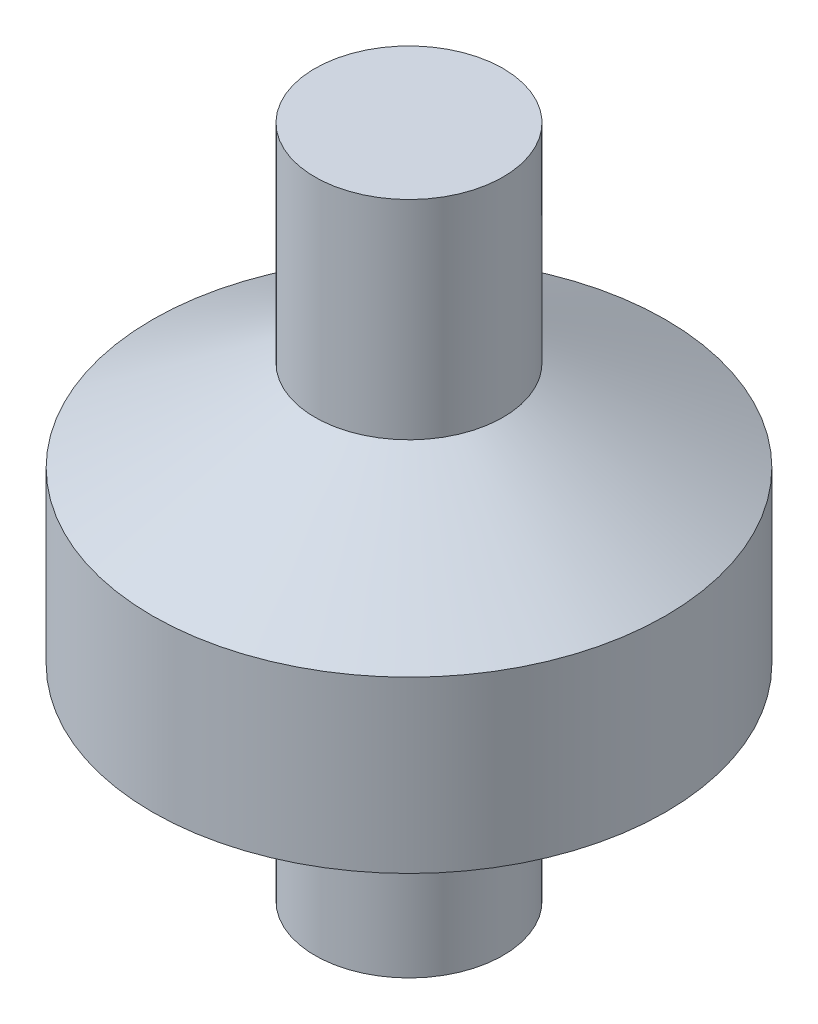
ISO-10303-21;
HEADER;
FILE_DESCRIPTION(('STEP AP214'),'2;1');
FILE_NAME('part.step','',(''),(''),'','','');
FILE_SCHEMA(('AUTOMOTIVE_DESIGN { 1 0 10303 214 1 1 1 1 }'));
ENDSEC;
DATA;
#1=APPLICATION_CONTEXT('core data for automotive mechanical design processes');
#2=APPLICATION_PROTOCOL_DEFINITION('international standard','automotive_design',2000,#1);
#3=PRODUCT_CONTEXT('',#1,'mechanical');
#4=PRODUCT('Part','Part','',(#3));
#5=PRODUCT_RELATED_PRODUCT_CATEGORY('part','',(#4));
#6=PRODUCT_DEFINITION_FORMATION('','',#4);
#7=PRODUCT_DEFINITION_CONTEXT('part definition',#1,'design');
#8=PRODUCT_DEFINITION('design','',#6,#7);
#9=PRODUCT_DEFINITION_SHAPE('','',#8);
#10=(LENGTH_UNIT() NAMED_UNIT(*) SI_UNIT(.MILLI.,.METRE.));
#11=(NAMED_UNIT(*) PLANE_ANGLE_UNIT() SI_UNIT($,.RADIAN.));
#12=(NAMED_UNIT(*) SI_UNIT($,.STERADIAN.) SOLID_ANGLE_UNIT());
#13=UNCERTAINTY_MEASURE_WITH_UNIT(LENGTH_MEASURE(1.E-05),#10,'distance_accuracy_value','');
#14=(GEOMETRIC_REPRESENTATION_CONTEXT(3) GLOBAL_UNCERTAINTY_ASSIGNED_CONTEXT((#13)) GLOBAL_UNIT_ASSIGNED_CONTEXT((#10,
#11,#12)) REPRESENTATION_CONTEXT('',''));
#15=CARTESIAN_POINT('',(0.,0.,0.));
#16=DIRECTION('',(0.,0.,1.));
#17=DIRECTION('',(1.,0.,0.));
#18=AXIS2_PLACEMENT_3D('',#15,#16,#17);
#19=CARTESIAN_POINT('',(0.,-22.7663301843638,0.));
#20=DIRECTION('',(0.,-1.,0.));
#21=DIRECTION('',(0.,0.,-1.));
#22=AXIS2_PLACEMENT_3D('',#19,#20,#21);
#23=CONICAL_SURFACE('',#22,30.,1.06192077681464);
#24=CARTESIAN_POINT('',(0.,-12.1665461052311,0.));
#25=DIRECTION('',(0.,-1.,0.));
#26=DIRECTION('',(0.,0.,-1.));
#27=AXIS2_PLACEMENT_3D('',#24,#25,#26);
#28=CIRCLE('',#27,11.);
#29=CARTESIAN_POINT('',(0.,-12.1665461052311,-11.));
#30=VERTEX_POINT('',#29);
#31=EDGE_CURVE('E61',#30,#30,#28,.T.);
#32=ORIENTED_EDGE('',*,*,#31,.T.);
#33=EDGE_LOOP('',(#32));
#34=FACE_BOUND('',#33,.T.);
#35=CARTESIAN_POINT('',(0.,-22.7663301843638,0.));
#36=DIRECTION('',(0.,-1.,0.));
#37=DIRECTION('',(0.,0.,-1.));
#38=AXIS2_PLACEMENT_3D('',#35,#36,#37);
#39=CIRCLE('',#38,30.);
#40=CARTESIAN_POINT('',(0.,-22.7663301843638,-30.));
#41=VERTEX_POINT('',#40);
#42=EDGE_CURVE('E10',#41,#41,#39,.T.);
#43=ORIENTED_EDGE('',*,*,#42,.F.);
#44=EDGE_LOOP('',(#43));
#45=FACE_BOUND('',#44,.T.);
#46=ADVANCED_FACE('F33',(#34,#45),#23,.T.);
#47=CARTESIAN_POINT('',(0.,-66.6581319094313,0.));
#48=DIRECTION('',(0.,-1.,0.));
#49=DIRECTION('',(0.,0.,-1.));
#50=AXIS2_PLACEMENT_3D('',#47,#48,#49);
#51=CYLINDRICAL_SURFACE('',#50,30.);
#52=ORIENTED_EDGE('',*,*,#42,.T.);
#53=EDGE_LOOP('',(#52));
#54=FACE_BOUND('',#53,.T.);
#55=CARTESIAN_POINT('',(0.,-42.6400696764829,0.));
#56=DIRECTION('',(0.,-1.,0.));
#57=DIRECTION('',(0.,0.,-1.));
#58=AXIS2_PLACEMENT_3D('',#55,#56,#57);
#59=CIRCLE('',#58,30.);
#60=CARTESIAN_POINT('',(0.,-42.6400696764829,-30.));
#61=VERTEX_POINT('',#60);
#62=EDGE_CURVE('E39',#61,#61,#59,.T.);
#63=ORIENTED_EDGE('',*,*,#62,.F.);
#64=EDGE_LOOP('',(#63));
#65=FACE_BOUND('',#64,.T.);
#66=ADVANCED_FACE('F79',(#54,#65),#51,.T.);
#67=CARTESIAN_POINT('',(30.,-42.6400696764829,0.));
#68=DIRECTION('',(0.,-1.,0.));
#69=DIRECTION('',(0.,0.,-1.));
#70=AXIS2_PLACEMENT_3D('',#67,#68,#69);
#71=PLANE('',#70);
#72=ORIENTED_EDGE('',*,*,#62,.T.);
#73=EDGE_LOOP('',(#72));
#74=FACE_BOUND('',#73,.T.);
#75=CARTESIAN_POINT('',(0.,-42.6400696764829,0.));
#76=DIRECTION('',(0.,-1.,0.));
#77=DIRECTION('',(0.,0.,-1.));
#78=AXIS2_PLACEMENT_3D('',#75,#76,#77);
#79=CIRCLE('',#78,20.9167286773776);
#80=CARTESIAN_POINT('',(0.,-42.6400696764829,-20.9167286773776));
#81=VERTEX_POINT('',#80);
#82=EDGE_CURVE('E43',#81,#81,#79,.T.);
#83=ORIENTED_EDGE('',*,*,#82,.F.);
#84=EDGE_LOOP('',(#83));
#85=FACE_BOUND('',#84,.T.);
#86=ADVANCED_FACE('F83',(#74,#85),#71,.T.);
#87=CARTESIAN_POINT('',(0.,-66.6581319094313,0.));
#88=DIRECTION('',(0.,-1.,0.));
#89=DIRECTION('',(0.,0.,-1.));
#90=AXIS2_PLACEMENT_3D('',#87,#88,#89);
#91=CYLINDRICAL_SURFACE('',#90,20.9167286773776);
#92=ORIENTED_EDGE('',*,*,#82,.T.);
#93=EDGE_LOOP('',(#92));
#94=FACE_BOUND('',#93,.T.);
#95=CARTESIAN_POINT('',(0.,-45.7507419448145,0.));
#96=DIRECTION('',(0.,-1.,0.));
#97=DIRECTION('',(0.,0.,-1.));
#98=AXIS2_PLACEMENT_3D('',#95,#96,#97);
#99=CIRCLE('',#98,20.9167286773776);
#100=CARTESIAN_POINT('',(0.,-45.7507419448145,-20.9167286773776));
#101=VERTEX_POINT('',#100);
#102=EDGE_CURVE('E47',#101,#101,#99,.T.);
#103=ORIENTED_EDGE('',*,*,#102,.F.);
#104=EDGE_LOOP('',(#103));
#105=FACE_BOUND('',#104,.T.);
#106=ADVANCED_FACE('F87',(#94,#105),#91,.T.);
#107=CARTESIAN_POINT('',(20.9167286773776,-45.7507419448145,0.));
#108=DIRECTION('',(0.,-1.,0.));
#109=DIRECTION('',(0.,0.,-1.));
#110=AXIS2_PLACEMENT_3D('',#107,#108,#109);
#111=PLANE('',#110);
#112=ORIENTED_EDGE('',*,*,#102,.T.);
#113=EDGE_LOOP('',(#112));
#114=FACE_BOUND('',#113,.T.);
#115=CARTESIAN_POINT('',(0.,-45.7507419448145,0.));
#116=DIRECTION('',(0.,-1.,0.));
#117=DIRECTION('',(0.,0.,-1.));
#118=AXIS2_PLACEMENT_3D('',#115,#116,#117);
#119=CIRCLE('',#118,11.);
#120=CARTESIAN_POINT('',(0.,-45.7507419448145,-11.));
#121=VERTEX_POINT('',#120);
#122=EDGE_CURVE('E52',#121,#121,#119,.T.);
#123=ORIENTED_EDGE('',*,*,#122,.F.);
#124=EDGE_LOOP('',(#123));
#125=FACE_BOUND('',#124,.T.);
#126=ADVANCED_FACE('F93',(#114,#125),#111,.T.);
#127=CARTESIAN_POINT('',(0.,-66.6581319094313,0.));
#128=DIRECTION('',(0.,-1.,0.));
#129=DIRECTION('',(0.,0.,-1.));
#130=AXIS2_PLACEMENT_3D('',#127,#128,#129);
#131=CYLINDRICAL_SURFACE('',#130,11.);
#132=ORIENTED_EDGE('',*,*,#122,.T.);
#133=EDGE_LOOP('',(#132));
#134=FACE_BOUND('',#133,.T.);
#135=CARTESIAN_POINT('',(0.,-66.6581319094313,0.));
#136=DIRECTION('',(0.,-1.,0.));
#137=DIRECTION('',(0.,0.,-1.));
#138=AXIS2_PLACEMENT_3D('',#135,#136,#137);
#139=CIRCLE('',#138,11.);
#140=CARTESIAN_POINT('',(0.,-66.6581319094313,-11.));
#141=VERTEX_POINT('',#140);
#142=EDGE_CURVE('E55',#141,#141,#139,.T.);
#143=ORIENTED_EDGE('',*,*,#142,.F.);
#144=EDGE_LOOP('',(#143));
#145=FACE_BOUND('',#144,.T.);
#146=ADVANCED_FACE('F97',(#134,#145),#131,.T.);
#147=CARTESIAN_POINT('',(11.,-66.6581319094313,0.));
#148=DIRECTION('',(0.,-1.,0.));
#149=DIRECTION('',(0.,0.,-1.));
#150=AXIS2_PLACEMENT_3D('',#147,#148,#149);
#151=PLANE('',#150);
#152=ORIENTED_EDGE('',*,*,#142,.T.);
#153=EDGE_LOOP('',(#152));
#154=FACE_BOUND('',#153,.T.);
#155=ADVANCED_FACE('F75',(#154),#151,.T.);
#156=CARTESIAN_POINT('',(0.,12.1665461052311,0.));
#157=DIRECTION('',(0.,1.,0.));
#158=DIRECTION('',(0.,0.,1.));
#159=AXIS2_PLACEMENT_3D('',#156,#157,#158);
#160=PLANE('',#159);
#161=CARTESIAN_POINT('',(0.,12.1665461052311,0.));
#162=DIRECTION('',(0.,-1.,0.));
#163=DIRECTION('',(0.,0.,-1.));
#164=AXIS2_PLACEMENT_3D('',#161,#162,#163);
#165=CIRCLE('',#164,11.);
#166=CARTESIAN_POINT('',(0.,12.1665461052311,-11.));
#167=VERTEX_POINT('',#166);
#168=EDGE_CURVE('E58',#167,#167,#165,.T.);
#169=ORIENTED_EDGE('',*,*,#168,.F.);
#170=EDGE_LOOP('',(#169));
#171=FACE_BOUND('',#170,.T.);
#172=ADVANCED_FACE('F69',(#171),#160,.T.);
#173=CARTESIAN_POINT('',(0.,-66.6581319094313,0.));
#174=DIRECTION('',(0.,-1.,0.));
#175=DIRECTION('',(0.,0.,-1.));
#176=AXIS2_PLACEMENT_3D('',#173,#174,#175);
#177=CYLINDRICAL_SURFACE('',#176,11.);
#178=ORIENTED_EDGE('',*,*,#168,.T.);
#179=EDGE_LOOP('',(#178));
#180=FACE_BOUND('',#179,.T.);
#181=ORIENTED_EDGE('',*,*,#31,.F.);
#182=EDGE_LOOP('',(#181));
#183=FACE_BOUND('',#182,.T.);
#184=ADVANCED_FACE('F67',(#180,#183),#177,.T.);
#185=CLOSED_SHELL('',(#46,#66,#86,#106,#126,#146,#155,#172,#184));
#186=MANIFOLD_SOLID_BREP('B2',#185);
#187=ADVANCED_BREP_SHAPE_REPRESENTATION('',(#18,#186),#14);
#188=SHAPE_DEFINITION_REPRESENTATION(#9,#187);
ENDSEC;
END-ISO-10303-21;
